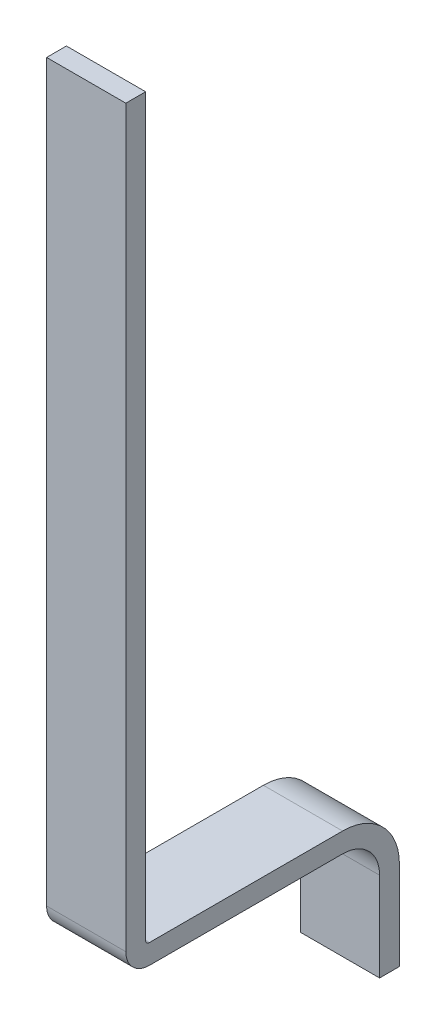
ISO-10303-21;
HEADER;
FILE_DESCRIPTION(('STEP AP214'),'2;1');
FILE_NAME('part.step','',(''),(''),'','','');
FILE_SCHEMA(('AUTOMOTIVE_DESIGN { 1 0 10303 214 1 1 1 1 }'));
ENDSEC;
DATA;
#1=APPLICATION_CONTEXT('core data for automotive mechanical design processes');
#2=APPLICATION_PROTOCOL_DEFINITION('international standard','automotive_design',2000,#1);
#3=PRODUCT_CONTEXT('',#1,'mechanical');
#4=PRODUCT('Part','Part','',(#3));
#5=PRODUCT_RELATED_PRODUCT_CATEGORY('part','',(#4));
#6=PRODUCT_DEFINITION_FORMATION('','',#4);
#7=PRODUCT_DEFINITION_CONTEXT('part definition',#1,'design');
#8=PRODUCT_DEFINITION('design','',#6,#7);
#9=PRODUCT_DEFINITION_SHAPE('','',#8);
#10=(LENGTH_UNIT() NAMED_UNIT(*) SI_UNIT(.MILLI.,.METRE.));
#11=(NAMED_UNIT(*) PLANE_ANGLE_UNIT() SI_UNIT($,.RADIAN.));
#12=(NAMED_UNIT(*) SI_UNIT($,.STERADIAN.) SOLID_ANGLE_UNIT());
#13=UNCERTAINTY_MEASURE_WITH_UNIT(LENGTH_MEASURE(1.E-05),#10,'distance_accuracy_value','');
#14=(GEOMETRIC_REPRESENTATION_CONTEXT(3) GLOBAL_UNCERTAINTY_ASSIGNED_CONTEXT((#13)) GLOBAL_UNIT_ASSIGNED_CONTEXT((#10,
#11,#12)) REPRESENTATION_CONTEXT('',''));
#15=CARTESIAN_POINT('',(0.,0.,0.));
#16=DIRECTION('',(0.,0.,1.));
#17=DIRECTION('',(1.,0.,0.));
#18=AXIS2_PLACEMENT_3D('',#15,#16,#17);
#19=CARTESIAN_POINT('',(0.4,-0.64427255887,-0.07445652518213));
#20=DIRECTION('',(1.,0.,0.));
#21=DIRECTION('',(0.,-1.,0.));
#22=AXIS2_PLACEMENT_3D('',#19,#20,#21);
#23=PLANE('',#22);
#24=DIRECTION('',(0.,1.,0.));
#25=VECTOR('',#24,1.);
#26=CARTESIAN_POINT('',(0.4,-1.811092747482,0.16));
#27=LINE('',#26,#25);
#28=CARTESIAN_POINT('',(0.4,-1.811092747482,0.16));
#29=VERTEX_POINT('',#28);
#30=CARTESIAN_POINT('',(0.4,1.9,0.16));
#31=VERTEX_POINT('',#30);
#32=EDGE_CURVE('E152',#29,#31,#27,.T.);
#33=ORIENTED_EDGE('',*,*,#32,.T.);
#34=DIRECTION('',(0.,0.,1.));
#35=VECTOR('',#34,1.);
#36=CARTESIAN_POINT('',(0.4,1.9,0.16));
#37=LINE('',#36,#35);
#38=CARTESIAN_POINT('',(0.4,1.9,0.26));
#39=VERTEX_POINT('',#38);
#40=EDGE_CURVE('E150',#31,#39,#37,.T.);
#41=ORIENTED_EDGE('',*,*,#40,.T.);
#42=DIRECTION('',(0.,-1.,0.));
#43=VECTOR('',#42,1.);
#44=CARTESIAN_POINT('',(0.4,1.9,0.26));
#45=LINE('',#44,#43);
#46=CARTESIAN_POINT('',(0.4,-1.811092747482,0.26));
#47=VERTEX_POINT('',#46);
#48=EDGE_CURVE('E135',#39,#47,#45,.T.);
#49=ORIENTED_EDGE('',*,*,#48,.T.);
#50=CARTESIAN_POINT('',(0.4,-1.811092747482,0.140528023696));
#51=DIRECTION('',(1.,0.,0.));
#52=DIRECTION('',(0.,1.,0.));
#53=AXIS2_PLACEMENT_3D('',#50,#51,#52);
#54=CIRCLE('',#53,0.119471976304);
#55=CARTESIAN_POINT('',(0.4,-1.930564723786,0.140528023696));
#56=VERTEX_POINT('',#55);
#57=EDGE_CURVE('E201',#47,#56,#54,.T.);
#58=ORIENTED_EDGE('',*,*,#57,.T.);
#59=DIRECTION('',(0.,0.,-1.));
#60=VECTOR('',#59,1.);
#61=CARTESIAN_POINT('',(0.4,-1.930564723786,0.140528023696));
#62=LINE('',#61,#60);
#63=CARTESIAN_POINT('',(0.4,-1.930564723786,-0.834763344159));
#64=VERTEX_POINT('',#63);
#65=EDGE_CURVE('E184',#56,#64,#62,.T.);
#66=ORIENTED_EDGE('',*,*,#65,.T.);
#67=CARTESIAN_POINT('',(0.4,-2.117351316963,-0.834763344159));
#68=DIRECTION('',(1.,0.,0.));
#69=DIRECTION('',(0.,1.,0.));
#70=AXIS2_PLACEMENT_3D('',#67,#68,#69);
#71=CIRCLE('',#70,0.186786593177);
#72=CARTESIAN_POINT('',(0.4,-2.117351316963,-1.021549937336));
#73=VERTEX_POINT('',#72);
#74=EDGE_CURVE('E217',#73,#64,#71,.T.);
#75=ORIENTED_EDGE('',*,*,#74,.F.);
#76=DIRECTION('',(0.,-1.,0.));
#77=VECTOR('',#76,1.);
#78=CARTESIAN_POINT('',(0.4,-2.117351316963,-1.021549937336));
#79=LINE('',#78,#77);
#80=CARTESIAN_POINT('',(0.4,-2.566872544918,-1.021549937336));
#81=VERTEX_POINT('',#80);
#82=EDGE_CURVE('E218',#73,#81,#79,.T.);
#83=ORIENTED_EDGE('',*,*,#82,.T.);
#84=DIRECTION('',(0.,0.,-1.));
#85=VECTOR('',#84,1.);
#86=CARTESIAN_POINT('',(0.4,-2.566872544918,-1.021549937336));
#87=LINE('',#86,#85);
#88=CARTESIAN_POINT('',(0.4,-2.566872544918,-1.121549937336));
#89=VERTEX_POINT('',#88);
#90=EDGE_CURVE('E172',#81,#89,#87,.T.);
#91=ORIENTED_EDGE('',*,*,#90,.T.);
#92=DIRECTION('',(0.,1.,0.));
#93=VECTOR('',#92,1.);
#94=CARTESIAN_POINT('',(0.4,-2.566872544918,-1.121549937336));
#95=LINE('',#94,#93);
#96=CARTESIAN_POINT('',(0.4,-2.117351316963,-1.121549937336));
#97=VERTEX_POINT('',#96);
#98=EDGE_CURVE('E242',#89,#97,#95,.T.);
#99=ORIENTED_EDGE('',*,*,#98,.T.);
#100=CARTESIAN_POINT('',(0.4,-2.117351316963,-0.834763344159));
#101=DIRECTION('',(1.,0.,0.));
#102=DIRECTION('',(0.,1.,0.));
#103=AXIS2_PLACEMENT_3D('',#100,#101,#102);
#104=CIRCLE('',#103,0.286786593177);
#105=CARTESIAN_POINT('',(0.4,-1.830564723786,-0.834763344159));
#106=VERTEX_POINT('',#105);
#107=EDGE_CURVE('E180',#97,#106,#104,.T.);
#108=ORIENTED_EDGE('',*,*,#107,.T.);
#109=DIRECTION('',(0.,0.,1.));
#110=VECTOR('',#109,1.);
#111=CARTESIAN_POINT('',(0.4,-1.830564723786,-0.834763344159));
#112=LINE('',#111,#110);
#113=CARTESIAN_POINT('',(0.4,-1.830564723786,0.140528023696));
#114=VERTEX_POINT('',#113);
#115=EDGE_CURVE('E260',#106,#114,#112,.T.);
#116=ORIENTED_EDGE('',*,*,#115,.T.);
#117=CARTESIAN_POINT('',(0.4,-1.811092747482,0.140528023696));
#118=DIRECTION('',(1.,0.,0.));
#119=DIRECTION('',(0.,1.,0.));
#120=AXIS2_PLACEMENT_3D('',#117,#118,#119);
#121=CIRCLE('',#120,0.01947197630395);
#122=EDGE_CURVE('E11',#29,#114,#121,.T.);
#123=ORIENTED_EDGE('',*,*,#122,.F.);
#124=EDGE_LOOP('',(#33,#41,#49,#58,#66,#75,#83,#91,#99,#108,#116,#123));
#125=FACE_BOUND('',#124,.T.);
#126=ADVANCED_FACE('F17',(#125),#23,.T.);
#127=CARTESIAN_POINT('',(0.,-0.64427255887,-0.07445652518213));
#128=DIRECTION('',(1.,0.,0.));
#129=DIRECTION('',(0.,-1.,0.));
#130=AXIS2_PLACEMENT_3D('',#127,#128,#129);
#131=PLANE('',#130);
#132=DIRECTION('',(0.,1.,0.));
#133=VECTOR('',#132,1.);
#134=CARTESIAN_POINT('',(0.,-1.811092747482,0.16));
#135=LINE('',#134,#133);
#136=CARTESIAN_POINT('',(0.,-1.811092747482,0.16));
#137=VERTEX_POINT('',#136);
#138=CARTESIAN_POINT('',(0.,1.9,0.16));
#139=VERTEX_POINT('',#138);
#140=EDGE_CURVE('E403',#137,#139,#135,.T.);
#141=ORIENTED_EDGE('',*,*,#140,.F.);
#142=CARTESIAN_POINT('',(0.,-1.811092747482,0.140528023696));
#143=DIRECTION('',(1.,0.,0.));
#144=DIRECTION('',(0.,1.,0.));
#145=AXIS2_PLACEMENT_3D('',#142,#143,#144);
#146=CIRCLE('',#145,0.01947197630395);
#147=CARTESIAN_POINT('',(0.,-1.830564723786,0.140528023696));
#148=VERTEX_POINT('',#147);
#149=EDGE_CURVE('E26',#137,#148,#146,.T.);
#150=ORIENTED_EDGE('',*,*,#149,.T.);
#151=DIRECTION('',(0.,0.,1.));
#152=VECTOR('',#151,1.);
#153=CARTESIAN_POINT('',(0.,-1.830564723786,-0.834763344159));
#154=LINE('',#153,#152);
#155=CARTESIAN_POINT('',(0.,-1.830564723786,-0.834763344159));
#156=VERTEX_POINT('',#155);
#157=EDGE_CURVE('E252',#156,#148,#154,.T.);
#158=ORIENTED_EDGE('',*,*,#157,.F.);
#159=CARTESIAN_POINT('',(0.,-2.117351316963,-0.834763344159));
#160=DIRECTION('',(1.,0.,0.));
#161=DIRECTION('',(0.,1.,0.));
#162=AXIS2_PLACEMENT_3D('',#159,#160,#161);
#163=CIRCLE('',#162,0.286786593177);
#164=CARTESIAN_POINT('',(0.,-2.117351316963,-1.121549937336));
#165=VERTEX_POINT('',#164);
#166=EDGE_CURVE('E181',#165,#156,#163,.T.);
#167=ORIENTED_EDGE('',*,*,#166,.F.);
#168=DIRECTION('',(0.,1.,0.));
#169=VECTOR('',#168,1.);
#170=CARTESIAN_POINT('',(0.,-2.566872544918,-1.121549937336));
#171=LINE('',#170,#169);
#172=CARTESIAN_POINT('',(0.,-2.566872544918,-1.121549937336));
#173=VERTEX_POINT('',#172);
#174=EDGE_CURVE('E205',#173,#165,#171,.T.);
#175=ORIENTED_EDGE('',*,*,#174,.F.);
#176=DIRECTION('',(0.,0.,-1.));
#177=VECTOR('',#176,1.);
#178=CARTESIAN_POINT('',(0.,-2.566872544918,-1.021549937336));
#179=LINE('',#178,#177);
#180=CARTESIAN_POINT('',(0.,-2.566872544918,-1.021549937336));
#181=VERTEX_POINT('',#180);
#182=EDGE_CURVE('E173',#181,#173,#179,.T.);
#183=ORIENTED_EDGE('',*,*,#182,.F.);
#184=DIRECTION('',(0.,-1.,0.));
#185=VECTOR('',#184,1.);
#186=CARTESIAN_POINT('',(0.,-2.117351316963,-1.021549937336));
#187=LINE('',#186,#185);
#188=CARTESIAN_POINT('',(0.,-2.117351316963,-1.021549937336));
#189=VERTEX_POINT('',#188);
#190=EDGE_CURVE('E225',#189,#181,#187,.T.);
#191=ORIENTED_EDGE('',*,*,#190,.F.);
#192=CARTESIAN_POINT('',(0.,-2.117351316963,-0.834763344159));
#193=DIRECTION('',(1.,0.,0.));
#194=DIRECTION('',(0.,1.,0.));
#195=AXIS2_PLACEMENT_3D('',#192,#193,#194);
#196=CIRCLE('',#195,0.186786593177);
#197=CARTESIAN_POINT('',(0.,-1.930564723786,-0.834763344159));
#198=VERTEX_POINT('',#197);
#199=EDGE_CURVE('E188',#189,#198,#196,.T.);
#200=ORIENTED_EDGE('',*,*,#199,.T.);
#201=DIRECTION('',(0.,0.,-1.));
#202=VECTOR('',#201,1.);
#203=CARTESIAN_POINT('',(0.,-1.930564723786,0.140528023696));
#204=LINE('',#203,#202);
#205=CARTESIAN_POINT('',(0.,-1.930564723786,0.140528023696));
#206=VERTEX_POINT('',#205);
#207=EDGE_CURVE('E193',#206,#198,#204,.T.);
#208=ORIENTED_EDGE('',*,*,#207,.F.);
#209=CARTESIAN_POINT('',(0.,-1.811092747482,0.140528023696));
#210=DIRECTION('',(1.,0.,0.));
#211=DIRECTION('',(0.,1.,0.));
#212=AXIS2_PLACEMENT_3D('',#209,#210,#211);
#213=CIRCLE('',#212,0.119471976304);
#214=CARTESIAN_POINT('',(0.,-1.811092747482,0.26));
#215=VERTEX_POINT('',#214);
#216=EDGE_CURVE('E147',#215,#206,#213,.T.);
#217=ORIENTED_EDGE('',*,*,#216,.F.);
#218=DIRECTION('',(0.,-1.,0.));
#219=VECTOR('',#218,1.);
#220=CARTESIAN_POINT('',(0.,1.9,0.26));
#221=LINE('',#220,#219);
#222=CARTESIAN_POINT('',(0.,1.9,0.26));
#223=VERTEX_POINT('',#222);
#224=EDGE_CURVE('E157',#223,#215,#221,.T.);
#225=ORIENTED_EDGE('',*,*,#224,.F.);
#226=DIRECTION('',(0.,0.,1.));
#227=VECTOR('',#226,1.);
#228=CARTESIAN_POINT('',(0.,1.9,0.16));
#229=LINE('',#228,#227);
#230=EDGE_CURVE('E160',#139,#223,#229,.T.);
#231=ORIENTED_EDGE('',*,*,#230,.F.);
#232=EDGE_LOOP('',(#141,#150,#158,#167,#175,#183,#191,#200,#208,#217,#225,#231));
#233=FACE_BOUND('',#232,.T.);
#234=ADVANCED_FACE('F19',(#233),#131,.F.);
#235=CARTESIAN_POINT('',(0.,-1.811092747482,0.140528023696));
#236=DIRECTION('',(-1.,0.,0.));
#237=DIRECTION('',(0.,1.,0.));
#238=AXIS2_PLACEMENT_3D('',#235,#236,#237);
#239=CYLINDRICAL_SURFACE('',#238,0.01947197630395);
#240=ORIENTED_EDGE('',*,*,#149,.F.);
#241=DIRECTION('',(1.,0.,0.));
#242=VECTOR('',#241,1.);
#243=CARTESIAN_POINT('',(0.,-1.811092747482,0.16));
#244=LINE('',#243,#242);
#245=EDGE_CURVE('E407',#137,#29,#244,.T.);
#246=ORIENTED_EDGE('',*,*,#245,.T.);
#247=ORIENTED_EDGE('',*,*,#122,.T.);
#248=DIRECTION('',(1.,0.,0.));
#249=VECTOR('',#248,1.);
#250=CARTESIAN_POINT('',(0.,-1.830564723786,0.140528023696));
#251=LINE('',#250,#249);
#252=EDGE_CURVE('E256',#148,#114,#251,.T.);
#253=ORIENTED_EDGE('',*,*,#252,.F.);
#254=EDGE_LOOP('',(#240,#246,#247,#253));
#255=FACE_BOUND('',#254,.T.);
#256=ADVANCED_FACE('F344',(#255),#239,.F.);
#257=CARTESIAN_POINT('',(0.,-1.830564723786,-0.834763344159));
#258=DIRECTION('',(0.,-1.,0.));
#259=DIRECTION('',(-1.,0.,0.));
#260=AXIS2_PLACEMENT_3D('',#257,#258,#259);
#261=PLANE('',#260);
#262=DIRECTION('',(1.,0.,0.));
#263=VECTOR('',#262,1.);
#264=CARTESIAN_POINT('',(0.,-1.830564723786,-0.834763344159));
#265=LINE('',#264,#263);
#266=EDGE_CURVE('E176',#156,#106,#265,.T.);
#267=ORIENTED_EDGE('',*,*,#266,.F.);
#268=ORIENTED_EDGE('',*,*,#157,.T.);
#269=ORIENTED_EDGE('',*,*,#252,.T.);
#270=ORIENTED_EDGE('',*,*,#115,.F.);
#271=EDGE_LOOP('',(#267,#268,#269,#270));
#272=FACE_BOUND('',#271,.T.);
#273=ADVANCED_FACE('F323',(#272),#261,.F.);
#274=CARTESIAN_POINT('',(0.,-2.117351316963,-0.834763344159));
#275=DIRECTION('',(-1.,0.,0.));
#276=DIRECTION('',(0.,1.,0.));
#277=AXIS2_PLACEMENT_3D('',#274,#275,#276);
#278=CYLINDRICAL_SURFACE('',#277,0.286786593177);
#279=DIRECTION('',(1.,0.,0.));
#280=VECTOR('',#279,1.);
#281=CARTESIAN_POINT('',(0.,-2.117351316963,-1.121549937336));
#282=LINE('',#281,#280);
#283=EDGE_CURVE('E232',#165,#97,#282,.T.);
#284=ORIENTED_EDGE('',*,*,#283,.F.);
#285=ORIENTED_EDGE('',*,*,#166,.T.);
#286=ORIENTED_EDGE('',*,*,#266,.T.);
#287=ORIENTED_EDGE('',*,*,#107,.F.);
#288=EDGE_LOOP('',(#284,#285,#286,#287));
#289=FACE_BOUND('',#288,.T.);
#290=ADVANCED_FACE('F317',(#289),#278,.T.);
#291=CARTESIAN_POINT('',(0.,-2.566872544918,-1.121549937336));
#292=DIRECTION('',(0.,0.,1.));
#293=DIRECTION('',(0.,-1.,0.));
#294=AXIS2_PLACEMENT_3D('',#291,#292,#293);
#295=PLANE('',#294);
#296=DIRECTION('',(1.,0.,0.));
#297=VECTOR('',#296,1.);
#298=CARTESIAN_POINT('',(0.,-2.566872544918,-1.121549937336));
#299=LINE('',#298,#297);
#300=EDGE_CURVE('E168',#173,#89,#299,.T.);
#301=ORIENTED_EDGE('',*,*,#300,.F.);
#302=ORIENTED_EDGE('',*,*,#174,.T.);
#303=ORIENTED_EDGE('',*,*,#283,.T.);
#304=ORIENTED_EDGE('',*,*,#98,.F.);
#305=EDGE_LOOP('',(#301,#302,#303,#304));
#306=FACE_BOUND('',#305,.T.);
#307=ADVANCED_FACE('F322',(#306),#295,.F.);
#308=CARTESIAN_POINT('',(0.,-2.566872544918,-1.021549937336));
#309=DIRECTION('',(0.,1.,0.));
#310=DIRECTION('',(1.,0.,0.));
#311=AXIS2_PLACEMENT_3D('',#308,#309,#310);
#312=PLANE('',#311);
#313=DIRECTION('',(1.,0.,0.));
#314=VECTOR('',#313,1.);
#315=CARTESIAN_POINT('',(0.,-2.566872544918,-1.021549937336));
#316=LINE('',#315,#314);
#317=EDGE_CURVE('E222',#181,#81,#316,.T.);
#318=ORIENTED_EDGE('',*,*,#317,.F.);
#319=ORIENTED_EDGE('',*,*,#182,.T.);
#320=ORIENTED_EDGE('',*,*,#300,.T.);
#321=ORIENTED_EDGE('',*,*,#90,.F.);
#322=EDGE_LOOP('',(#318,#319,#320,#321));
#323=FACE_BOUND('',#322,.T.);
#324=ADVANCED_FACE('F298',(#323),#312,.F.);
#325=CARTESIAN_POINT('',(0.,-2.117351316963,-1.021549937336));
#326=DIRECTION('',(0.,0.,-1.));
#327=DIRECTION('',(0.,-1.,0.));
#328=AXIS2_PLACEMENT_3D('',#325,#326,#327);
#329=PLANE('',#328);
#330=DIRECTION('',(1.,0.,0.));
#331=VECTOR('',#330,1.);
#332=CARTESIAN_POINT('',(0.,-2.117351316963,-1.021549937336));
#333=LINE('',#332,#331);
#334=EDGE_CURVE('E213',#189,#73,#333,.T.);
#335=ORIENTED_EDGE('',*,*,#334,.F.);
#336=ORIENTED_EDGE('',*,*,#190,.T.);
#337=ORIENTED_EDGE('',*,*,#317,.T.);
#338=ORIENTED_EDGE('',*,*,#82,.F.);
#339=EDGE_LOOP('',(#335,#336,#337,#338));
#340=FACE_BOUND('',#339,.T.);
#341=ADVANCED_FACE('F293',(#340),#329,.F.);
#342=CARTESIAN_POINT('',(0.,-2.117351316963,-0.834763344159));
#343=DIRECTION('',(-1.,0.,0.));
#344=DIRECTION('',(0.,1.,0.));
#345=AXIS2_PLACEMENT_3D('',#342,#343,#344);
#346=CYLINDRICAL_SURFACE('',#345,0.186786593177);
#347=ORIENTED_EDGE('',*,*,#199,.F.);
#348=ORIENTED_EDGE('',*,*,#334,.T.);
#349=ORIENTED_EDGE('',*,*,#74,.T.);
#350=DIRECTION('',(1.,0.,0.));
#351=VECTOR('',#350,1.);
#352=CARTESIAN_POINT('',(0.,-1.930564723786,-0.834763344159));
#353=LINE('',#352,#351);
#354=EDGE_CURVE('E189',#198,#64,#353,.T.);
#355=ORIENTED_EDGE('',*,*,#354,.F.);
#356=EDGE_LOOP('',(#347,#348,#349,#355));
#357=FACE_BOUND('',#356,.T.);
#358=ADVANCED_FACE('F275',(#357),#346,.F.);
#359=CARTESIAN_POINT('',(0.,-1.930564723786,0.140528023696));
#360=DIRECTION('',(0.,1.,0.));
#361=DIRECTION('',(1.,0.,0.));
#362=AXIS2_PLACEMENT_3D('',#359,#360,#361);
#363=PLANE('',#362);
#364=DIRECTION('',(1.,0.,0.));
#365=VECTOR('',#364,1.);
#366=CARTESIAN_POINT('',(0.,-1.930564723786,0.140528023696));
#367=LINE('',#366,#365);
#368=EDGE_CURVE('E197',#206,#56,#367,.T.);
#369=ORIENTED_EDGE('',*,*,#368,.F.);
#370=ORIENTED_EDGE('',*,*,#207,.T.);
#371=ORIENTED_EDGE('',*,*,#354,.T.);
#372=ORIENTED_EDGE('',*,*,#65,.F.);
#373=EDGE_LOOP('',(#369,#370,#371,#372));
#374=FACE_BOUND('',#373,.T.);
#375=ADVANCED_FACE('F269',(#374),#363,.F.);
#376=CARTESIAN_POINT('',(0.,-1.811092747482,0.140528023696));
#377=DIRECTION('',(-1.,0.,0.));
#378=DIRECTION('',(0.,1.,0.));
#379=AXIS2_PLACEMENT_3D('',#376,#377,#378);
#380=CYLINDRICAL_SURFACE('',#379,0.119471976304);
#381=DIRECTION('',(1.,0.,0.));
#382=VECTOR('',#381,1.);
#383=CARTESIAN_POINT('',(0.,-1.811092747482,0.26));
#384=LINE('',#383,#382);
#385=EDGE_CURVE('E143',#215,#47,#384,.T.);
#386=ORIENTED_EDGE('',*,*,#385,.F.);
#387=ORIENTED_EDGE('',*,*,#216,.T.);
#388=ORIENTED_EDGE('',*,*,#368,.T.);
#389=ORIENTED_EDGE('',*,*,#57,.F.);
#390=EDGE_LOOP('',(#386,#387,#388,#389));
#391=FACE_BOUND('',#390,.T.);
#392=ADVANCED_FACE('F274',(#391),#380,.T.);
#393=CARTESIAN_POINT('',(0.,1.9,0.26));
#394=DIRECTION('',(0.,0.,-1.));
#395=DIRECTION('',(0.,-1.,0.));
#396=AXIS2_PLACEMENT_3D('',#393,#394,#395);
#397=PLANE('',#396);
#398=DIRECTION('',(1.,0.,0.));
#399=VECTOR('',#398,1.);
#400=CARTESIAN_POINT('',(0.,1.9,0.26));
#401=LINE('',#400,#399);
#402=EDGE_CURVE('E140',#223,#39,#401,.T.);
#403=ORIENTED_EDGE('',*,*,#402,.F.);
#404=ORIENTED_EDGE('',*,*,#224,.T.);
#405=ORIENTED_EDGE('',*,*,#385,.T.);
#406=ORIENTED_EDGE('',*,*,#48,.F.);
#407=EDGE_LOOP('',(#403,#404,#405,#406));
#408=FACE_BOUND('',#407,.T.);
#409=ADVANCED_FACE('F137',(#408),#397,.F.);
#410=CARTESIAN_POINT('',(0.,1.9,0.16));
#411=DIRECTION('',(0.,-1.,0.));
#412=DIRECTION('',(-1.,0.,0.));
#413=AXIS2_PLACEMENT_3D('',#410,#411,#412);
#414=PLANE('',#413);
#415=DIRECTION('',(1.,0.,0.));
#416=VECTOR('',#415,1.);
#417=CARTESIAN_POINT('',(0.,1.9,0.16));
#418=LINE('',#417,#416);
#419=EDGE_CURVE('E406',#139,#31,#418,.T.);
#420=ORIENTED_EDGE('',*,*,#419,.F.);
#421=ORIENTED_EDGE('',*,*,#230,.T.);
#422=ORIENTED_EDGE('',*,*,#402,.T.);
#423=ORIENTED_EDGE('',*,*,#40,.F.);
#424=EDGE_LOOP('',(#420,#421,#422,#423));
#425=FACE_BOUND('',#424,.T.);
#426=ADVANCED_FACE('F159',(#425),#414,.F.);
#427=CARTESIAN_POINT('',(0.,-1.811092747482,0.16));
#428=DIRECTION('',(0.,0.,1.));
#429=DIRECTION('',(0.,-1.,0.));
#430=AXIS2_PLACEMENT_3D('',#427,#428,#429);
#431=PLANE('',#430);
#432=ORIENTED_EDGE('',*,*,#245,.F.);
#433=ORIENTED_EDGE('',*,*,#140,.T.);
#434=ORIENTED_EDGE('',*,*,#419,.T.);
#435=ORIENTED_EDGE('',*,*,#32,.F.);
#436=EDGE_LOOP('',(#432,#433,#434,#435));
#437=FACE_BOUND('',#436,.T.);
#438=ADVANCED_FACE('F283',(#437),#431,.F.);
#439=CLOSED_SHELL('',(#126,#234,#256,#273,#290,#307,#324,#341,#358,#375,#392,#409,#426,#438));
#440=MANIFOLD_SOLID_BREP('B1',#439);
#441=ADVANCED_BREP_SHAPE_REPRESENTATION('',(#18,#440),#14);
#442=SHAPE_DEFINITION_REPRESENTATION(#9,#441);
ENDSEC;
END-ISO-10303-21;
